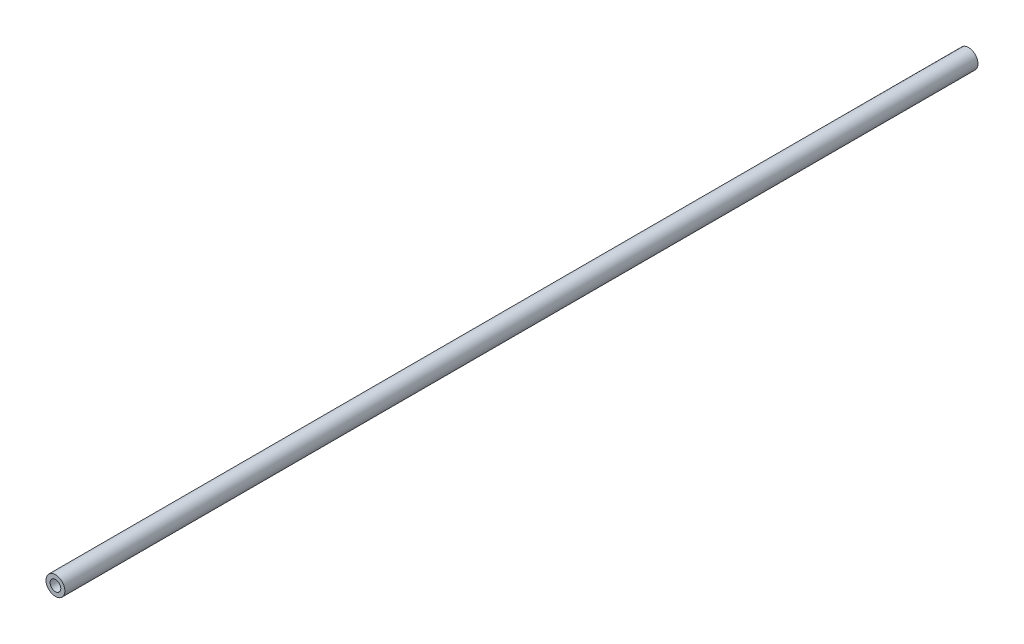
ISO-10303-21;
HEADER;
FILE_DESCRIPTION(('STEP AP214'),'2;1');
FILE_NAME('part.step','',(''),(''),'','','');
FILE_SCHEMA(('AUTOMOTIVE_DESIGN { 1 0 10303 214 1 1 1 1 }'));
ENDSEC;
DATA;
#1=APPLICATION_CONTEXT('core data for automotive mechanical design processes');
#2=APPLICATION_PROTOCOL_DEFINITION('international standard','automotive_design',2000,#1);
#3=PRODUCT_CONTEXT('',#1,'mechanical');
#4=PRODUCT('Part','Part','',(#3));
#5=PRODUCT_RELATED_PRODUCT_CATEGORY('part','',(#4));
#6=PRODUCT_DEFINITION_FORMATION('','',#4);
#7=PRODUCT_DEFINITION_CONTEXT('part definition',#1,'design');
#8=PRODUCT_DEFINITION('design','',#6,#7);
#9=PRODUCT_DEFINITION_SHAPE('','',#8);
#10=(LENGTH_UNIT() NAMED_UNIT(*) SI_UNIT(.MILLI.,.METRE.));
#11=(NAMED_UNIT(*) PLANE_ANGLE_UNIT() SI_UNIT($,.RADIAN.));
#12=(NAMED_UNIT(*) SI_UNIT($,.STERADIAN.) SOLID_ANGLE_UNIT());
#13=UNCERTAINTY_MEASURE_WITH_UNIT(LENGTH_MEASURE(1.E-05),#10,'distance_accuracy_value','');
#14=(GEOMETRIC_REPRESENTATION_CONTEXT(3) GLOBAL_UNCERTAINTY_ASSIGNED_CONTEXT((#13)) GLOBAL_UNIT_ASSIGNED_CONTEXT((#10,
#11,#12)) REPRESENTATION_CONTEXT('',''));
#15=CARTESIAN_POINT('',(0.,0.,0.));
#16=DIRECTION('',(0.,0.,1.));
#17=DIRECTION('',(1.,0.,0.));
#18=AXIS2_PLACEMENT_3D('',#15,#16,#17);
#19=CARTESIAN_POINT('',(0.,0.,580.));
#20=DIRECTION('',(0.,0.,1.));
#21=DIRECTION('',(1.,0.,0.));
#22=AXIS2_PLACEMENT_3D('',#19,#20,#21);
#23=PLANE('',#22);
#24=CARTESIAN_POINT('',(0.,0.,580.));
#25=DIRECTION('',(0.,0.,1.));
#26=DIRECTION('',(1.,0.,0.));
#27=AXIS2_PLACEMENT_3D('',#24,#25,#26);
#28=CIRCLE('',#27,6.);
#29=CARTESIAN_POINT('',(6.,0.,580.));
#30=VERTEX_POINT('',#29);
#31=EDGE_CURVE('E12',#30,#30,#28,.T.);
#32=ORIENTED_EDGE('',*,*,#31,.T.);
#33=EDGE_LOOP('',(#32));
#34=FACE_BOUND('',#33,.T.);
#35=CARTESIAN_POINT('',(0.,0.,580.));
#36=DIRECTION('',(0.,0.,1.));
#37=DIRECTION('',(1.,0.,0.));
#38=AXIS2_PLACEMENT_3D('',#35,#36,#37);
#39=CIRCLE('',#38,3.4);
#40=CARTESIAN_POINT('',(3.4,0.,580.));
#41=VERTEX_POINT('',#40);
#42=EDGE_CURVE('E53',#41,#41,#39,.T.);
#43=ORIENTED_EDGE('',*,*,#42,.F.);
#44=EDGE_LOOP('',(#43));
#45=FACE_BOUND('',#44,.T.);
#46=ADVANCED_FACE('F42',(#34,#45),#23,.T.);
#47=CARTESIAN_POINT('',(0.,0.,0.));
#48=DIRECTION('',(0.,0.,1.));
#49=DIRECTION('',(1.,0.,0.));
#50=AXIS2_PLACEMENT_3D('',#47,#48,#49);
#51=PLANE('',#50);
#52=CARTESIAN_POINT('',(0.,0.,0.));
#53=DIRECTION('',(0.,0.,1.));
#54=DIRECTION('',(1.,0.,0.));
#55=AXIS2_PLACEMENT_3D('',#52,#53,#54);
#56=CIRCLE('',#55,6.);
#57=CARTESIAN_POINT('',(6.,0.,0.));
#58=VERTEX_POINT('',#57);
#59=EDGE_CURVE('E46',#58,#58,#56,.T.);
#60=ORIENTED_EDGE('',*,*,#59,.F.);
#61=EDGE_LOOP('',(#60));
#62=FACE_BOUND('',#61,.T.);
#63=CARTESIAN_POINT('',(0.,0.,0.));
#64=DIRECTION('',(0.,0.,1.));
#65=DIRECTION('',(1.,0.,0.));
#66=AXIS2_PLACEMENT_3D('',#63,#64,#65);
#67=CIRCLE('',#66,3.4);
#68=CARTESIAN_POINT('',(3.4,0.,0.));
#69=VERTEX_POINT('',#68);
#70=EDGE_CURVE('E55',#69,#69,#67,.T.);
#71=ORIENTED_EDGE('',*,*,#70,.T.);
#72=EDGE_LOOP('',(#71));
#73=FACE_BOUND('',#72,.T.);
#74=ADVANCED_FACE('F65',(#62,#73),#51,.F.);
#75=CARTESIAN_POINT('',(0.,0.,580.));
#76=DIRECTION('',(0.,0.,-1.));
#77=DIRECTION('',(-1.,0.,0.));
#78=AXIS2_PLACEMENT_3D('',#75,#76,#77);
#79=CYLINDRICAL_SURFACE('',#78,6.);
#80=ORIENTED_EDGE('',*,*,#31,.F.);
#81=EDGE_LOOP('',(#80));
#82=FACE_BOUND('',#81,.T.);
#83=ORIENTED_EDGE('',*,*,#59,.T.);
#84=EDGE_LOOP('',(#83));
#85=FACE_BOUND('',#84,.T.);
#86=ADVANCED_FACE('F44',(#82,#85),#79,.T.);
#87=CARTESIAN_POINT('',(0.,0.,580.));
#88=DIRECTION('',(0.,0.,-1.));
#89=DIRECTION('',(-1.,0.,0.));
#90=AXIS2_PLACEMENT_3D('',#87,#88,#89);
#91=CYLINDRICAL_SURFACE('',#90,3.4);
#92=ORIENTED_EDGE('',*,*,#42,.T.);
#93=EDGE_LOOP('',(#92));
#94=FACE_BOUND('',#93,.T.);
#95=ORIENTED_EDGE('',*,*,#70,.F.);
#96=EDGE_LOOP('',(#95));
#97=FACE_BOUND('',#96,.T.);
#98=ADVANCED_FACE('F61',(#94,#97),#91,.F.);
#99=CLOSED_SHELL('',(#46,#74,#86,#98));
#100=MANIFOLD_SOLID_BREP('B2',#99);
#101=ADVANCED_BREP_SHAPE_REPRESENTATION('',(#18,#100),#14);
#102=SHAPE_DEFINITION_REPRESENTATION(#9,#101);
ENDSEC;
END-ISO-10303-21;
